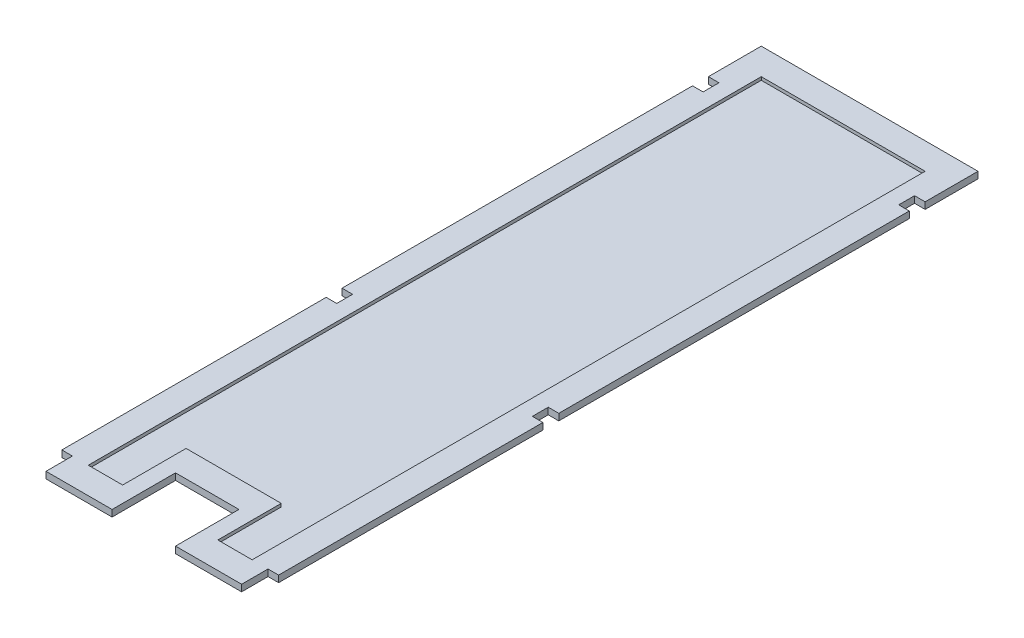
ISO-10303-21;
HEADER;
FILE_DESCRIPTION(('STEP AP214'),'2;1');
FILE_NAME('part.step','',(''),(''),'','','');
FILE_SCHEMA(('AUTOMOTIVE_DESIGN { 1 0 10303 214 1 1 1 1 }'));
ENDSEC;
DATA;
#1=APPLICATION_CONTEXT('core data for automotive mechanical design processes');
#2=APPLICATION_PROTOCOL_DEFINITION('international standard','automotive_design',2000,#1);
#3=PRODUCT_CONTEXT('',#1,'mechanical');
#4=PRODUCT('Part','Part','',(#3));
#5=PRODUCT_RELATED_PRODUCT_CATEGORY('part','',(#4));
#6=PRODUCT_DEFINITION_FORMATION('','',#4);
#7=PRODUCT_DEFINITION_CONTEXT('part definition',#1,'design');
#8=PRODUCT_DEFINITION('design','',#6,#7);
#9=PRODUCT_DEFINITION_SHAPE('','',#8);
#10=(LENGTH_UNIT() NAMED_UNIT(*) SI_UNIT(.MILLI.,.METRE.));
#11=(NAMED_UNIT(*) PLANE_ANGLE_UNIT() SI_UNIT($,.RADIAN.));
#12=(NAMED_UNIT(*) SI_UNIT($,.STERADIAN.) SOLID_ANGLE_UNIT());
#13=UNCERTAINTY_MEASURE_WITH_UNIT(LENGTH_MEASURE(1.E-05),#10,'distance_accuracy_value','');
#14=(GEOMETRIC_REPRESENTATION_CONTEXT(3) GLOBAL_UNCERTAINTY_ASSIGNED_CONTEXT((#13)) GLOBAL_UNIT_ASSIGNED_CONTEXT((#10,
#11,#12)) REPRESENTATION_CONTEXT('',''));
#15=CARTESIAN_POINT('',(0.,0.,0.));
#16=DIRECTION('',(0.,0.,1.));
#17=DIRECTION('',(1.,0.,0.));
#18=AXIS2_PLACEMENT_3D('',#15,#16,#17);
#19=CARTESIAN_POINT('',(0.,1.25,-55.));
#20=DIRECTION('',(0.,0.,1.));
#21=DIRECTION('',(1.,0.,0.));
#22=AXIS2_PLACEMENT_3D('',#19,#20,#21);
#23=PLANE('',#22);
#24=DIRECTION('',(-1.,0.,0.));
#25=VECTOR('',#24,1.);
#26=CARTESIAN_POINT('',(0.,0.,-55.));
#27=LINE('',#26,#25);
#28=CARTESIAN_POINT('',(2.00000000000002,0.,-55.));
#29=VERTEX_POINT('',#28);
#30=CARTESIAN_POINT('',(0.,0.,-55.));
#31=VERTEX_POINT('',#30);
#32=EDGE_CURVE('E260',#29,#31,#27,.T.);
#33=ORIENTED_EDGE('',*,*,#32,.T.);
#34=DIRECTION('',(0.,-1.,0.));
#35=VECTOR('',#34,1.);
#36=CARTESIAN_POINT('',(0.,1.25,-55.));
#37=LINE('',#36,#35);
#38=CARTESIAN_POINT('',(0.,1.25,-55.));
#39=VERTEX_POINT('',#38);
#40=EDGE_CURVE('E11',#39,#31,#37,.T.);
#41=ORIENTED_EDGE('',*,*,#40,.F.);
#42=DIRECTION('',(-1.,0.,0.));
#43=VECTOR('',#42,1.);
#44=CARTESIAN_POINT('',(0.,1.25,-55.));
#45=LINE('',#44,#43);
#46=CARTESIAN_POINT('',(2.00000000000002,1.25,-55.));
#47=VERTEX_POINT('',#46);
#48=EDGE_CURVE('E316',#47,#39,#45,.T.);
#49=ORIENTED_EDGE('',*,*,#48,.F.);
#50=DIRECTION('',(0.,-1.,0.));
#51=VECTOR('',#50,1.);
#52=CARTESIAN_POINT('',(2.00000000000002,1.25,-55.));
#53=LINE('',#52,#51);
#54=EDGE_CURVE('E256',#47,#29,#53,.T.);
#55=ORIENTED_EDGE('',*,*,#54,.T.);
#56=EDGE_LOOP('',(#33,#41,#49,#55));
#57=FACE_BOUND('',#56,.T.);
#58=ADVANCED_FACE('F32',(#57),#23,.F.);
#59=CARTESIAN_POINT('',(0.,1.25,-5.));
#60=DIRECTION('',(1.,0.,0.));
#61=DIRECTION('',(0.,0.,-1.));
#62=AXIS2_PLACEMENT_3D('',#59,#60,#61);
#63=PLANE('',#62);
#64=DIRECTION('',(0.,0.,1.));
#65=VECTOR('',#64,1.);
#66=CARTESIAN_POINT('',(0.,0.,-5.));
#67=LINE('',#66,#65);
#68=CARTESIAN_POINT('',(0.,0.,-5.));
#69=VERTEX_POINT('',#68);
#70=EDGE_CURVE('E263',#31,#69,#67,.T.);
#71=ORIENTED_EDGE('',*,*,#70,.T.);
#72=DIRECTION('',(0.,-1.,0.));
#73=VECTOR('',#72,1.);
#74=CARTESIAN_POINT('',(0.,1.25,-5.));
#75=LINE('',#74,#73);
#76=CARTESIAN_POINT('',(0.,1.25,-5.));
#77=VERTEX_POINT('',#76);
#78=EDGE_CURVE('E39',#77,#69,#75,.T.);
#79=ORIENTED_EDGE('',*,*,#78,.F.);
#80=DIRECTION('',(0.,0.,1.));
#81=VECTOR('',#80,1.);
#82=CARTESIAN_POINT('',(0.,1.25,-5.));
#83=LINE('',#82,#81);
#84=EDGE_CURVE('E156',#39,#77,#83,.T.);
#85=ORIENTED_EDGE('',*,*,#84,.F.);
#86=ORIENTED_EDGE('',*,*,#40,.T.);
#87=EDGE_LOOP('',(#71,#79,#85,#86));
#88=FACE_BOUND('',#87,.T.);
#89=ADVANCED_FACE('F608',(#88),#63,.F.);
#90=CARTESIAN_POINT('',(0.,1.25,-5.));
#91=DIRECTION('',(0.,0.,-1.));
#92=DIRECTION('',(-1.,0.,0.));
#93=AXIS2_PLACEMENT_3D('',#90,#91,#92);
#94=PLANE('',#93);
#95=DIRECTION('',(1.,0.,0.));
#96=VECTOR('',#95,1.);
#97=CARTESIAN_POINT('',(0.,0.,-5.));
#98=LINE('',#97,#96);
#99=CARTESIAN_POINT('',(2.,0.,-5.));
#100=VERTEX_POINT('',#99);
#101=EDGE_CURVE('E266',#69,#100,#98,.T.);
#102=ORIENTED_EDGE('',*,*,#101,.T.);
#103=DIRECTION('',(0.,-1.,0.));
#104=VECTOR('',#103,1.);
#105=CARTESIAN_POINT('',(2.,1.25,-5.));
#106=LINE('',#105,#104);
#107=CARTESIAN_POINT('',(2.,1.25,-5.));
#108=VERTEX_POINT('',#107);
#109=EDGE_CURVE('E383',#108,#100,#106,.T.);
#110=ORIENTED_EDGE('',*,*,#109,.F.);
#111=DIRECTION('',(1.,0.,0.));
#112=VECTOR('',#111,1.);
#113=CARTESIAN_POINT('',(0.,1.25,-5.));
#114=LINE('',#113,#112);
#115=EDGE_CURVE('E391',#77,#108,#114,.T.);
#116=ORIENTED_EDGE('',*,*,#115,.F.);
#117=ORIENTED_EDGE('',*,*,#78,.T.);
#118=EDGE_LOOP('',(#102,#110,#116,#117));
#119=FACE_BOUND('',#118,.T.);
#120=ADVANCED_FACE('F389',(#119),#94,.F.);
#121=CARTESIAN_POINT('',(2.,1.25,0.));
#122=DIRECTION('',(1.,0.,0.));
#123=DIRECTION('',(0.,0.,-1.));
#124=AXIS2_PLACEMENT_3D('',#121,#122,#123);
#125=PLANE('',#124);
#126=DIRECTION('',(0.,0.,1.));
#127=VECTOR('',#126,1.);
#128=CARTESIAN_POINT('',(2.,0.,0.));
#129=LINE('',#128,#127);
#130=CARTESIAN_POINT('',(2.,0.,0.));
#131=VERTEX_POINT('',#130);
#132=EDGE_CURVE('E268',#100,#131,#129,.T.);
#133=ORIENTED_EDGE('',*,*,#132,.T.);
#134=DIRECTION('',(0.,-1.,0.));
#135=VECTOR('',#134,1.);
#136=CARTESIAN_POINT('',(2.,1.25,0.));
#137=LINE('',#136,#135);
#138=CARTESIAN_POINT('',(2.,1.25,0.));
#139=VERTEX_POINT('',#138);
#140=EDGE_CURVE('E380',#139,#131,#137,.T.);
#141=ORIENTED_EDGE('',*,*,#140,.F.);
#142=DIRECTION('',(0.,0.,1.));
#143=VECTOR('',#142,1.);
#144=CARTESIAN_POINT('',(2.,1.25,0.));
#145=LINE('',#144,#143);
#146=EDGE_CURVE('E409',#108,#139,#145,.T.);
#147=ORIENTED_EDGE('',*,*,#146,.F.);
#148=ORIENTED_EDGE('',*,*,#109,.T.);
#149=EDGE_LOOP('',(#133,#141,#147,#148));
#150=FACE_BOUND('',#149,.T.);
#151=ADVANCED_FACE('F400',(#150),#125,.F.);
#152=CARTESIAN_POINT('',(2.,1.25,0.));
#153=DIRECTION('',(0.,0.,-1.));
#154=DIRECTION('',(-1.,0.,0.));
#155=AXIS2_PLACEMENT_3D('',#152,#153,#154);
#156=PLANE('',#155);
#157=DIRECTION('',(1.,0.,0.));
#158=VECTOR('',#157,1.);
#159=CARTESIAN_POINT('',(2.,0.,0.));
#160=LINE('',#159,#158);
#161=CARTESIAN_POINT('',(14.5,0.,0.));
#162=VERTEX_POINT('',#161);
#163=EDGE_CURVE('E270',#131,#162,#160,.T.);
#164=ORIENTED_EDGE('',*,*,#163,.T.);
#165=DIRECTION('',(0.,-1.,0.));
#166=VECTOR('',#165,1.);
#167=CARTESIAN_POINT('',(14.5,1.25,0.));
#168=LINE('',#167,#166);
#169=CARTESIAN_POINT('',(14.5,1.25,0.));
#170=VERTEX_POINT('',#169);
#171=EDGE_CURVE('E377',#170,#162,#168,.T.);
#172=ORIENTED_EDGE('',*,*,#171,.F.);
#173=DIRECTION('',(1.,0.,0.));
#174=VECTOR('',#173,1.);
#175=CARTESIAN_POINT('',(2.,1.25,0.));
#176=LINE('',#175,#174);
#177=EDGE_CURVE('E406',#139,#170,#176,.T.);
#178=ORIENTED_EDGE('',*,*,#177,.F.);
#179=ORIENTED_EDGE('',*,*,#140,.T.);
#180=EDGE_LOOP('',(#164,#172,#178,#179));
#181=FACE_BOUND('',#180,.T.);
#182=ADVANCED_FACE('F404',(#181),#156,.F.);
#183=CARTESIAN_POINT('',(14.5,1.25,0.));
#184=DIRECTION('',(-1.,0.,0.));
#185=DIRECTION('',(0.,0.,1.));
#186=AXIS2_PLACEMENT_3D('',#183,#184,#185);
#187=PLANE('',#186);
#188=DIRECTION('',(0.,0.,-1.));
#189=VECTOR('',#188,1.);
#190=CARTESIAN_POINT('',(14.5,0.,0.));
#191=LINE('',#190,#189);
#192=CARTESIAN_POINT('',(14.5,0.,-12.));
#193=VERTEX_POINT('',#192);
#194=EDGE_CURVE('E272',#162,#193,#191,.T.);
#195=ORIENTED_EDGE('',*,*,#194,.T.);
#196=DIRECTION('',(0.,-1.,0.));
#197=VECTOR('',#196,1.);
#198=CARTESIAN_POINT('',(14.5,1.25,-12.));
#199=LINE('',#198,#197);
#200=CARTESIAN_POINT('',(14.5,1.25,-12.));
#201=VERTEX_POINT('',#200);
#202=EDGE_CURVE('E374',#201,#193,#199,.T.);
#203=ORIENTED_EDGE('',*,*,#202,.F.);
#204=DIRECTION('',(0.,0.,-1.));
#205=VECTOR('',#204,1.);
#206=CARTESIAN_POINT('',(14.5,1.25,0.));
#207=LINE('',#206,#205);
#208=EDGE_CURVE('E408',#170,#201,#207,.T.);
#209=ORIENTED_EDGE('',*,*,#208,.F.);
#210=ORIENTED_EDGE('',*,*,#171,.T.);
#211=EDGE_LOOP('',(#195,#203,#209,#210));
#212=FACE_BOUND('',#211,.T.);
#213=ADVANCED_FACE('F621',(#212),#187,.F.);
#214=CARTESIAN_POINT('',(14.5,1.25,-12.));
#215=DIRECTION('',(0.,0.,-1.));
#216=DIRECTION('',(-1.,0.,0.));
#217=AXIS2_PLACEMENT_3D('',#214,#215,#216);
#218=PLANE('',#217);
#219=DIRECTION('',(1.,0.,0.));
#220=VECTOR('',#219,1.);
#221=CARTESIAN_POINT('',(14.5,0.,-12.));
#222=LINE('',#221,#220);
#223=CARTESIAN_POINT('',(26.5,0.,-12.));
#224=VERTEX_POINT('',#223);
#225=EDGE_CURVE('E274',#193,#224,#222,.T.);
#226=ORIENTED_EDGE('',*,*,#225,.T.);
#227=DIRECTION('',(0.,-1.,0.));
#228=VECTOR('',#227,1.);
#229=CARTESIAN_POINT('',(26.5,1.25,-12.));
#230=LINE('',#229,#228);
#231=CARTESIAN_POINT('',(26.5,1.25,-12.));
#232=VERTEX_POINT('',#231);
#233=EDGE_CURVE('E371',#232,#224,#230,.T.);
#234=ORIENTED_EDGE('',*,*,#233,.F.);
#235=DIRECTION('',(1.,0.,0.));
#236=VECTOR('',#235,1.);
#237=CARTESIAN_POINT('',(14.5,1.25,-12.));
#238=LINE('',#237,#236);
#239=EDGE_CURVE('E411',#201,#232,#238,.T.);
#240=ORIENTED_EDGE('',*,*,#239,.F.);
#241=ORIENTED_EDGE('',*,*,#202,.T.);
#242=EDGE_LOOP('',(#226,#234,#240,#241));
#243=FACE_BOUND('',#242,.T.);
#244=ADVANCED_FACE('F624',(#243),#218,.F.);
#245=CARTESIAN_POINT('',(26.5,1.25,0.));
#246=DIRECTION('',(1.,0.,0.));
#247=DIRECTION('',(0.,0.,-1.));
#248=AXIS2_PLACEMENT_3D('',#245,#246,#247);
#249=PLANE('',#248);
#250=DIRECTION('',(0.,0.,1.));
#251=VECTOR('',#250,1.);
#252=CARTESIAN_POINT('',(26.5,0.,0.));
#253=LINE('',#252,#251);
#254=CARTESIAN_POINT('',(26.5,0.,0.));
#255=VERTEX_POINT('',#254);
#256=EDGE_CURVE('E276',#224,#255,#253,.T.);
#257=ORIENTED_EDGE('',*,*,#256,.T.);
#258=DIRECTION('',(0.,-1.,0.));
#259=VECTOR('',#258,1.);
#260=CARTESIAN_POINT('',(26.5,1.25,0.));
#261=LINE('',#260,#259);
#262=CARTESIAN_POINT('',(26.5,1.25,0.));
#263=VERTEX_POINT('',#262);
#264=EDGE_CURVE('E368',#263,#255,#261,.T.);
#265=ORIENTED_EDGE('',*,*,#264,.F.);
#266=DIRECTION('',(0.,0.,1.));
#267=VECTOR('',#266,1.);
#268=CARTESIAN_POINT('',(26.5,1.25,0.));
#269=LINE('',#268,#267);
#270=EDGE_CURVE('E417',#232,#263,#269,.T.);
#271=ORIENTED_EDGE('',*,*,#270,.F.);
#272=ORIENTED_EDGE('',*,*,#233,.T.);
#273=EDGE_LOOP('',(#257,#265,#271,#272));
#274=FACE_BOUND('',#273,.T.);
#275=ADVANCED_FACE('F628',(#274),#249,.F.);
#276=CARTESIAN_POINT('',(26.5,1.25,0.));
#277=DIRECTION('',(0.,0.,-1.));
#278=DIRECTION('',(-1.,0.,0.));
#279=AXIS2_PLACEMENT_3D('',#276,#277,#278);
#280=PLANE('',#279);
#281=DIRECTION('',(1.,0.,0.));
#282=VECTOR('',#281,1.);
#283=CARTESIAN_POINT('',(26.5,0.,0.));
#284=LINE('',#283,#282);
#285=CARTESIAN_POINT('',(39.,0.,0.));
#286=VERTEX_POINT('',#285);
#287=EDGE_CURVE('E278',#255,#286,#284,.T.);
#288=ORIENTED_EDGE('',*,*,#287,.T.);
#289=DIRECTION('',(0.,-1.,0.));
#290=VECTOR('',#289,1.);
#291=CARTESIAN_POINT('',(39.,1.25,0.));
#292=LINE('',#291,#290);
#293=CARTESIAN_POINT('',(39.,1.25,0.));
#294=VERTEX_POINT('',#293);
#295=EDGE_CURVE('E365',#294,#286,#292,.T.);
#296=ORIENTED_EDGE('',*,*,#295,.F.);
#297=DIRECTION('',(1.,0.,0.));
#298=VECTOR('',#297,1.);
#299=CARTESIAN_POINT('',(26.5,1.25,0.));
#300=LINE('',#299,#298);
#301=EDGE_CURVE('E419',#263,#294,#300,.T.);
#302=ORIENTED_EDGE('',*,*,#301,.F.);
#303=ORIENTED_EDGE('',*,*,#264,.T.);
#304=EDGE_LOOP('',(#288,#296,#302,#303));
#305=FACE_BOUND('',#304,.T.);
#306=ADVANCED_FACE('F632',(#305),#280,.F.);
#307=CARTESIAN_POINT('',(39.,1.25,0.));
#308=DIRECTION('',(-1.,0.,0.));
#309=DIRECTION('',(0.,0.,1.));
#310=AXIS2_PLACEMENT_3D('',#307,#308,#309);
#311=PLANE('',#310);
#312=DIRECTION('',(0.,0.,-1.));
#313=VECTOR('',#312,1.);
#314=CARTESIAN_POINT('',(39.,0.,0.));
#315=LINE('',#314,#313);
#316=CARTESIAN_POINT('',(39.,0.,-5.));
#317=VERTEX_POINT('',#316);
#318=EDGE_CURVE('E280',#286,#317,#315,.T.);
#319=ORIENTED_EDGE('',*,*,#318,.T.);
#320=DIRECTION('',(0.,-1.,0.));
#321=VECTOR('',#320,1.);
#322=CARTESIAN_POINT('',(39.,1.25,-5.));
#323=LINE('',#322,#321);
#324=CARTESIAN_POINT('',(39.,1.25,-5.));
#325=VERTEX_POINT('',#324);
#326=EDGE_CURVE('E362',#325,#317,#323,.T.);
#327=ORIENTED_EDGE('',*,*,#326,.F.);
#328=DIRECTION('',(0.,0.,-1.));
#329=VECTOR('',#328,1.);
#330=CARTESIAN_POINT('',(39.,1.25,0.));
#331=LINE('',#330,#329);
#332=EDGE_CURVE('E421',#294,#325,#331,.T.);
#333=ORIENTED_EDGE('',*,*,#332,.F.);
#334=ORIENTED_EDGE('',*,*,#295,.T.);
#335=EDGE_LOOP('',(#319,#327,#333,#334));
#336=FACE_BOUND('',#335,.T.);
#337=ADVANCED_FACE('F636',(#336),#311,.F.);
#338=CARTESIAN_POINT('',(41.,1.25,-5.));
#339=DIRECTION('',(0.,0.,-1.));
#340=DIRECTION('',(-1.,0.,0.));
#341=AXIS2_PLACEMENT_3D('',#338,#339,#340);
#342=PLANE('',#341);
#343=DIRECTION('',(1.,0.,0.));
#344=VECTOR('',#343,1.);
#345=CARTESIAN_POINT('',(41.,0.,-5.));
#346=LINE('',#345,#344);
#347=CARTESIAN_POINT('',(41.,0.,-5.));
#348=VERTEX_POINT('',#347);
#349=EDGE_CURVE('E282',#317,#348,#346,.T.);
#350=ORIENTED_EDGE('',*,*,#349,.T.);
#351=DIRECTION('',(0.,-1.,0.));
#352=VECTOR('',#351,1.);
#353=CARTESIAN_POINT('',(41.,1.25,-5.));
#354=LINE('',#353,#352);
#355=CARTESIAN_POINT('',(41.,1.25,-5.));
#356=VERTEX_POINT('',#355);
#357=EDGE_CURVE('E359',#356,#348,#354,.T.);
#358=ORIENTED_EDGE('',*,*,#357,.F.);
#359=DIRECTION('',(1.,0.,0.));
#360=VECTOR('',#359,1.);
#361=CARTESIAN_POINT('',(41.,1.25,-5.));
#362=LINE('',#361,#360);
#363=EDGE_CURVE('E423',#325,#356,#362,.T.);
#364=ORIENTED_EDGE('',*,*,#363,.F.);
#365=ORIENTED_EDGE('',*,*,#326,.T.);
#366=EDGE_LOOP('',(#350,#358,#364,#365));
#367=FACE_BOUND('',#366,.T.);
#368=ADVANCED_FACE('F640',(#367),#342,.F.);
#369=CARTESIAN_POINT('',(41.,1.25,-5.));
#370=DIRECTION('',(-1.,0.,0.));
#371=DIRECTION('',(0.,0.,1.));
#372=AXIS2_PLACEMENT_3D('',#369,#370,#371);
#373=PLANE('',#372);
#374=DIRECTION('',(0.,0.,-1.));
#375=VECTOR('',#374,1.);
#376=CARTESIAN_POINT('',(41.,0.,-5.));
#377=LINE('',#376,#375);
#378=CARTESIAN_POINT('',(41.,0.,-55.));
#379=VERTEX_POINT('',#378);
#380=EDGE_CURVE('E284',#348,#379,#377,.T.);
#381=ORIENTED_EDGE('',*,*,#380,.T.);
#382=DIRECTION('',(0.,-1.,0.));
#383=VECTOR('',#382,1.);
#384=CARTESIAN_POINT('',(41.,1.25,-55.));
#385=LINE('',#384,#383);
#386=CARTESIAN_POINT('',(41.,1.25,-55.));
#387=VERTEX_POINT('',#386);
#388=EDGE_CURVE('E356',#387,#379,#385,.T.);
#389=ORIENTED_EDGE('',*,*,#388,.F.);
#390=DIRECTION('',(0.,0.,-1.));
#391=VECTOR('',#390,1.);
#392=CARTESIAN_POINT('',(41.,1.25,-5.));
#393=LINE('',#392,#391);
#394=EDGE_CURVE('E425',#356,#387,#393,.T.);
#395=ORIENTED_EDGE('',*,*,#394,.F.);
#396=ORIENTED_EDGE('',*,*,#357,.T.);
#397=EDGE_LOOP('',(#381,#389,#395,#396));
#398=FACE_BOUND('',#397,.T.);
#399=ADVANCED_FACE('F644',(#398),#373,.F.);
#400=CARTESIAN_POINT('',(41.,1.25,-55.));
#401=DIRECTION('',(0.,0.,1.));
#402=DIRECTION('',(1.,0.,0.));
#403=AXIS2_PLACEMENT_3D('',#400,#401,#402);
#404=PLANE('',#403);
#405=DIRECTION('',(-1.,0.,0.));
#406=VECTOR('',#405,1.);
#407=CARTESIAN_POINT('',(41.,0.,-55.));
#408=LINE('',#407,#406);
#409=CARTESIAN_POINT('',(39.,0.,-55.));
#410=VERTEX_POINT('',#409);
#411=EDGE_CURVE('E286',#379,#410,#408,.T.);
#412=ORIENTED_EDGE('',*,*,#411,.T.);
#413=DIRECTION('',(0.,-1.,0.));
#414=VECTOR('',#413,1.);
#415=CARTESIAN_POINT('',(39.,1.25,-55.));
#416=LINE('',#415,#414);
#417=CARTESIAN_POINT('',(39.,1.25,-55.));
#418=VERTEX_POINT('',#417);
#419=EDGE_CURVE('E353',#418,#410,#416,.T.);
#420=ORIENTED_EDGE('',*,*,#419,.F.);
#421=DIRECTION('',(-1.,0.,0.));
#422=VECTOR('',#421,1.);
#423=CARTESIAN_POINT('',(41.,1.25,-55.));
#424=LINE('',#423,#422);
#425=EDGE_CURVE('E427',#387,#418,#424,.T.);
#426=ORIENTED_EDGE('',*,*,#425,.F.);
#427=ORIENTED_EDGE('',*,*,#388,.T.);
#428=EDGE_LOOP('',(#412,#420,#426,#427));
#429=FACE_BOUND('',#428,.T.);
#430=ADVANCED_FACE('F648',(#429),#404,.F.);
#431=CARTESIAN_POINT('',(39.,1.25,-55.));
#432=DIRECTION('',(-1.,0.,0.));
#433=DIRECTION('',(0.,0.,1.));
#434=AXIS2_PLACEMENT_3D('',#431,#432,#433);
#435=PLANE('',#434);
#436=DIRECTION('',(0.,0.,-1.));
#437=VECTOR('',#436,1.);
#438=CARTESIAN_POINT('',(39.,0.,-55.));
#439=LINE('',#438,#437);
#440=CARTESIAN_POINT('',(39.,0.,-58.));
#441=VERTEX_POINT('',#440);
#442=EDGE_CURVE('E288',#410,#441,#439,.T.);
#443=ORIENTED_EDGE('',*,*,#442,.T.);
#444=DIRECTION('',(0.,-1.,0.));
#445=VECTOR('',#444,1.);
#446=CARTESIAN_POINT('',(39.,1.25,-58.));
#447=LINE('',#446,#445);
#448=CARTESIAN_POINT('',(39.,1.25,-58.));
#449=VERTEX_POINT('',#448);
#450=EDGE_CURVE('E350',#449,#441,#447,.T.);
#451=ORIENTED_EDGE('',*,*,#450,.F.);
#452=DIRECTION('',(0.,0.,-1.));
#453=VECTOR('',#452,1.);
#454=CARTESIAN_POINT('',(39.,1.25,-55.));
#455=LINE('',#454,#453);
#456=EDGE_CURVE('E429',#418,#449,#455,.T.);
#457=ORIENTED_EDGE('',*,*,#456,.F.);
#458=ORIENTED_EDGE('',*,*,#419,.T.);
#459=EDGE_LOOP('',(#443,#451,#457,#458));
#460=FACE_BOUND('',#459,.T.);
#461=ADVANCED_FACE('F652',(#460),#435,.F.);
#462=CARTESIAN_POINT('',(41.,1.25,-58.));
#463=DIRECTION('',(0.,0.,-1.));
#464=DIRECTION('',(-1.,0.,0.));
#465=AXIS2_PLACEMENT_3D('',#462,#463,#464);
#466=PLANE('',#465);
#467=DIRECTION('',(1.,0.,0.));
#468=VECTOR('',#467,1.);
#469=CARTESIAN_POINT('',(41.,0.,-58.));
#470=LINE('',#469,#468);
#471=CARTESIAN_POINT('',(41.,0.,-58.));
#472=VERTEX_POINT('',#471);
#473=EDGE_CURVE('E290',#441,#472,#470,.T.);
#474=ORIENTED_EDGE('',*,*,#473,.T.);
#475=DIRECTION('',(0.,-1.,0.));
#476=VECTOR('',#475,1.);
#477=CARTESIAN_POINT('',(41.,1.25,-58.));
#478=LINE('',#477,#476);
#479=CARTESIAN_POINT('',(41.,1.25,-58.));
#480=VERTEX_POINT('',#479);
#481=EDGE_CURVE('E347',#480,#472,#478,.T.);
#482=ORIENTED_EDGE('',*,*,#481,.F.);
#483=DIRECTION('',(1.,0.,0.));
#484=VECTOR('',#483,1.);
#485=CARTESIAN_POINT('',(41.,1.25,-58.));
#486=LINE('',#485,#484);
#487=EDGE_CURVE('E431',#449,#480,#486,.T.);
#488=ORIENTED_EDGE('',*,*,#487,.F.);
#489=ORIENTED_EDGE('',*,*,#450,.T.);
#490=EDGE_LOOP('',(#474,#482,#488,#489));
#491=FACE_BOUND('',#490,.T.);
#492=ADVANCED_FACE('F656',(#491),#466,.F.);
#493=CARTESIAN_POINT('',(41.,1.25,-58.));
#494=DIRECTION('',(-1.,0.,0.));
#495=DIRECTION('',(0.,0.,1.));
#496=AXIS2_PLACEMENT_3D('',#493,#494,#495);
#497=PLANE('',#496);
#498=DIRECTION('',(0.,0.,-1.));
#499=VECTOR('',#498,1.);
#500=CARTESIAN_POINT('',(41.,0.,-58.));
#501=LINE('',#500,#499);
#502=CARTESIAN_POINT('',(41.,0.,-124.3));
#503=VERTEX_POINT('',#502);
#504=EDGE_CURVE('E292',#472,#503,#501,.T.);
#505=ORIENTED_EDGE('',*,*,#504,.T.);
#506=DIRECTION('',(0.,-1.,0.));
#507=VECTOR('',#506,1.);
#508=CARTESIAN_POINT('',(41.,1.25,-124.3));
#509=LINE('',#508,#507);
#510=CARTESIAN_POINT('',(41.,1.25,-124.3));
#511=VERTEX_POINT('',#510);
#512=EDGE_CURVE('E344',#511,#503,#509,.T.);
#513=ORIENTED_EDGE('',*,*,#512,.F.);
#514=DIRECTION('',(0.,0.,-1.));
#515=VECTOR('',#514,1.);
#516=CARTESIAN_POINT('',(41.,1.25,-58.));
#517=LINE('',#516,#515);
#518=EDGE_CURVE('E433',#480,#511,#517,.T.);
#519=ORIENTED_EDGE('',*,*,#518,.F.);
#520=ORIENTED_EDGE('',*,*,#481,.T.);
#521=EDGE_LOOP('',(#505,#513,#519,#520));
#522=FACE_BOUND('',#521,.T.);
#523=ADVANCED_FACE('F660',(#522),#497,.F.);
#524=CARTESIAN_POINT('',(41.,1.25,-124.3));
#525=DIRECTION('',(0.,0.,1.));
#526=DIRECTION('',(1.,0.,0.));
#527=AXIS2_PLACEMENT_3D('',#524,#525,#526);
#528=PLANE('',#527);
#529=DIRECTION('',(-1.,0.,0.));
#530=VECTOR('',#529,1.);
#531=CARTESIAN_POINT('',(41.,0.,-124.3));
#532=LINE('',#531,#530);
#533=CARTESIAN_POINT('',(39.,0.,-124.3));
#534=VERTEX_POINT('',#533);
#535=EDGE_CURVE('E294',#503,#534,#532,.T.);
#536=ORIENTED_EDGE('',*,*,#535,.T.);
#537=DIRECTION('',(0.,-1.,0.));
#538=VECTOR('',#537,1.);
#539=CARTESIAN_POINT('',(39.,1.25,-124.3));
#540=LINE('',#539,#538);
#541=CARTESIAN_POINT('',(39.,1.25,-124.3));
#542=VERTEX_POINT('',#541);
#543=EDGE_CURVE('E341',#542,#534,#540,.T.);
#544=ORIENTED_EDGE('',*,*,#543,.F.);
#545=DIRECTION('',(-1.,0.,0.));
#546=VECTOR('',#545,1.);
#547=CARTESIAN_POINT('',(41.,1.25,-124.3));
#548=LINE('',#547,#546);
#549=EDGE_CURVE('E435',#511,#542,#548,.T.);
#550=ORIENTED_EDGE('',*,*,#549,.F.);
#551=ORIENTED_EDGE('',*,*,#512,.T.);
#552=EDGE_LOOP('',(#536,#544,#550,#551));
#553=FACE_BOUND('',#552,.T.);
#554=ADVANCED_FACE('F664',(#553),#528,.F.);
#555=CARTESIAN_POINT('',(39.,1.25,-124.3));
#556=DIRECTION('',(-1.,0.,0.));
#557=DIRECTION('',(0.,0.,1.));
#558=AXIS2_PLACEMENT_3D('',#555,#556,#557);
#559=PLANE('',#558);
#560=DIRECTION('',(0.,0.,-1.));
#561=VECTOR('',#560,1.);
#562=CARTESIAN_POINT('',(39.,0.,-124.3));
#563=LINE('',#562,#561);
#564=CARTESIAN_POINT('',(39.,0.,-127.3));
#565=VERTEX_POINT('',#564);
#566=EDGE_CURVE('E296',#534,#565,#563,.T.);
#567=ORIENTED_EDGE('',*,*,#566,.T.);
#568=DIRECTION('',(0.,-1.,0.));
#569=VECTOR('',#568,1.);
#570=CARTESIAN_POINT('',(39.,1.25,-127.3));
#571=LINE('',#570,#569);
#572=CARTESIAN_POINT('',(39.,1.25,-127.3));
#573=VERTEX_POINT('',#572);
#574=EDGE_CURVE('E338',#573,#565,#571,.T.);
#575=ORIENTED_EDGE('',*,*,#574,.F.);
#576=DIRECTION('',(0.,0.,-1.));
#577=VECTOR('',#576,1.);
#578=CARTESIAN_POINT('',(39.,1.25,-124.3));
#579=LINE('',#578,#577);
#580=EDGE_CURVE('E437',#542,#573,#579,.T.);
#581=ORIENTED_EDGE('',*,*,#580,.F.);
#582=ORIENTED_EDGE('',*,*,#543,.T.);
#583=EDGE_LOOP('',(#567,#575,#581,#582));
#584=FACE_BOUND('',#583,.T.);
#585=ADVANCED_FACE('F668',(#584),#559,.F.);
#586=CARTESIAN_POINT('',(41.,1.25,-127.3));
#587=DIRECTION('',(0.,0.,-1.));
#588=DIRECTION('',(-1.,0.,0.));
#589=AXIS2_PLACEMENT_3D('',#586,#587,#588);
#590=PLANE('',#589);
#591=DIRECTION('',(1.,0.,0.));
#592=VECTOR('',#591,1.);
#593=CARTESIAN_POINT('',(41.,0.,-127.3));
#594=LINE('',#593,#592);
#595=CARTESIAN_POINT('',(41.,0.,-127.3));
#596=VERTEX_POINT('',#595);
#597=EDGE_CURVE('E298',#565,#596,#594,.T.);
#598=ORIENTED_EDGE('',*,*,#597,.T.);
#599=DIRECTION('',(0.,-1.,0.));
#600=VECTOR('',#599,1.);
#601=CARTESIAN_POINT('',(41.,1.25,-127.3));
#602=LINE('',#601,#600);
#603=CARTESIAN_POINT('',(41.,1.25,-127.3));
#604=VERTEX_POINT('',#603);
#605=EDGE_CURVE('E335',#604,#596,#602,.T.);
#606=ORIENTED_EDGE('',*,*,#605,.F.);
#607=DIRECTION('',(1.,0.,0.));
#608=VECTOR('',#607,1.);
#609=CARTESIAN_POINT('',(41.,1.25,-127.3));
#610=LINE('',#609,#608);
#611=EDGE_CURVE('E439',#573,#604,#610,.T.);
#612=ORIENTED_EDGE('',*,*,#611,.F.);
#613=ORIENTED_EDGE('',*,*,#574,.T.);
#614=EDGE_LOOP('',(#598,#606,#612,#613));
#615=FACE_BOUND('',#614,.T.);
#616=ADVANCED_FACE('F672',(#615),#590,.F.);
#617=CARTESIAN_POINT('',(41.,1.25,-127.3));
#618=DIRECTION('',(-1.,0.,0.));
#619=DIRECTION('',(0.,0.,1.));
#620=AXIS2_PLACEMENT_3D('',#617,#618,#619);
#621=PLANE('',#620);
#622=DIRECTION('',(0.,0.,-1.));
#623=VECTOR('',#622,1.);
#624=CARTESIAN_POINT('',(41.,0.,-127.3));
#625=LINE('',#624,#623);
#626=CARTESIAN_POINT('',(41.,0.,-137.3));
#627=VERTEX_POINT('',#626);
#628=EDGE_CURVE('E300',#596,#627,#625,.T.);
#629=ORIENTED_EDGE('',*,*,#628,.T.);
#630=DIRECTION('',(0.,-1.,0.));
#631=VECTOR('',#630,1.);
#632=CARTESIAN_POINT('',(41.,1.25,-137.3));
#633=LINE('',#632,#631);
#634=CARTESIAN_POINT('',(41.,1.25,-137.3));
#635=VERTEX_POINT('',#634);
#636=EDGE_CURVE('E332',#635,#627,#633,.T.);
#637=ORIENTED_EDGE('',*,*,#636,.F.);
#638=DIRECTION('',(0.,0.,-1.));
#639=VECTOR('',#638,1.);
#640=CARTESIAN_POINT('',(41.,1.25,-127.3));
#641=LINE('',#640,#639);
#642=EDGE_CURVE('E441',#604,#635,#641,.T.);
#643=ORIENTED_EDGE('',*,*,#642,.F.);
#644=ORIENTED_EDGE('',*,*,#605,.T.);
#645=EDGE_LOOP('',(#629,#637,#643,#644));
#646=FACE_BOUND('',#645,.T.);
#647=ADVANCED_FACE('F676',(#646),#621,.F.);
#648=CARTESIAN_POINT('',(0.,1.25,-137.3));
#649=DIRECTION('',(0.,0.,1.));
#650=DIRECTION('',(1.,0.,0.));
#651=AXIS2_PLACEMENT_3D('',#648,#649,#650);
#652=PLANE('',#651);
#653=DIRECTION('',(-1.,0.,0.));
#654=VECTOR('',#653,1.);
#655=CARTESIAN_POINT('',(0.,0.,-137.3));
#656=LINE('',#655,#654);
#657=CARTESIAN_POINT('',(0.,0.,-137.3));
#658=VERTEX_POINT('',#657);
#659=EDGE_CURVE('E302',#627,#658,#656,.T.);
#660=ORIENTED_EDGE('',*,*,#659,.T.);
#661=DIRECTION('',(0.,-1.,0.));
#662=VECTOR('',#661,1.);
#663=CARTESIAN_POINT('',(0.,1.25,-137.3));
#664=LINE('',#663,#662);
#665=CARTESIAN_POINT('',(0.,1.25,-137.3));
#666=VERTEX_POINT('',#665);
#667=EDGE_CURVE('E329',#666,#658,#664,.T.);
#668=ORIENTED_EDGE('',*,*,#667,.F.);
#669=DIRECTION('',(-1.,0.,0.));
#670=VECTOR('',#669,1.);
#671=CARTESIAN_POINT('',(0.,1.25,-137.3));
#672=LINE('',#671,#670);
#673=EDGE_CURVE('E443',#635,#666,#672,.T.);
#674=ORIENTED_EDGE('',*,*,#673,.F.);
#675=ORIENTED_EDGE('',*,*,#636,.T.);
#676=EDGE_LOOP('',(#660,#668,#674,#675));
#677=FACE_BOUND('',#676,.T.);
#678=ADVANCED_FACE('F680',(#677),#652,.F.);
#679=CARTESIAN_POINT('',(0.,1.25,-127.3));
#680=DIRECTION('',(1.,0.,0.));
#681=DIRECTION('',(0.,0.,-1.));
#682=AXIS2_PLACEMENT_3D('',#679,#680,#681);
#683=PLANE('',#682);
#684=DIRECTION('',(0.,0.,1.));
#685=VECTOR('',#684,1.);
#686=CARTESIAN_POINT('',(0.,0.,-127.3));
#687=LINE('',#686,#685);
#688=CARTESIAN_POINT('',(0.,0.,-127.3));
#689=VERTEX_POINT('',#688);
#690=EDGE_CURVE('E304',#658,#689,#687,.T.);
#691=ORIENTED_EDGE('',*,*,#690,.T.);
#692=DIRECTION('',(0.,-1.,0.));
#693=VECTOR('',#692,1.);
#694=CARTESIAN_POINT('',(0.,1.25,-127.3));
#695=LINE('',#694,#693);
#696=CARTESIAN_POINT('',(0.,1.25,-127.3));
#697=VERTEX_POINT('',#696);
#698=EDGE_CURVE('E326',#697,#689,#695,.T.);
#699=ORIENTED_EDGE('',*,*,#698,.F.);
#700=DIRECTION('',(0.,0.,1.));
#701=VECTOR('',#700,1.);
#702=CARTESIAN_POINT('',(0.,1.25,-127.3));
#703=LINE('',#702,#701);
#704=EDGE_CURVE('E445',#666,#697,#703,.T.);
#705=ORIENTED_EDGE('',*,*,#704,.F.);
#706=ORIENTED_EDGE('',*,*,#667,.T.);
#707=EDGE_LOOP('',(#691,#699,#705,#706));
#708=FACE_BOUND('',#707,.T.);
#709=ADVANCED_FACE('F684',(#708),#683,.F.);
#710=CARTESIAN_POINT('',(0.,1.25,-127.3));
#711=DIRECTION('',(0.,0.,-1.));
#712=DIRECTION('',(-1.,0.,0.));
#713=AXIS2_PLACEMENT_3D('',#710,#711,#712);
#714=PLANE('',#713);
#715=DIRECTION('',(1.,0.,0.));
#716=VECTOR('',#715,1.);
#717=CARTESIAN_POINT('',(0.,0.,-127.3));
#718=LINE('',#717,#716);
#719=CARTESIAN_POINT('',(2.00000000000001,0.,-127.3));
#720=VERTEX_POINT('',#719);
#721=EDGE_CURVE('E306',#689,#720,#718,.T.);
#722=ORIENTED_EDGE('',*,*,#721,.T.);
#723=DIRECTION('',(0.,-1.,0.));
#724=VECTOR('',#723,1.);
#725=CARTESIAN_POINT('',(2.00000000000001,1.25,-127.3));
#726=LINE('',#725,#724);
#727=CARTESIAN_POINT('',(2.00000000000001,1.25,-127.3));
#728=VERTEX_POINT('',#727);
#729=EDGE_CURVE('E323',#728,#720,#726,.T.);
#730=ORIENTED_EDGE('',*,*,#729,.F.);
#731=DIRECTION('',(1.,0.,0.));
#732=VECTOR('',#731,1.);
#733=CARTESIAN_POINT('',(0.,1.25,-127.3));
#734=LINE('',#733,#732);
#735=EDGE_CURVE('E447',#697,#728,#734,.T.);
#736=ORIENTED_EDGE('',*,*,#735,.F.);
#737=ORIENTED_EDGE('',*,*,#698,.T.);
#738=EDGE_LOOP('',(#722,#730,#736,#737));
#739=FACE_BOUND('',#738,.T.);
#740=ADVANCED_FACE('F688',(#739),#714,.F.);
#741=CARTESIAN_POINT('',(2.00000000000001,1.25,-127.3));
#742=DIRECTION('',(1.,0.,0.));
#743=DIRECTION('',(0.,0.,-1.));
#744=AXIS2_PLACEMENT_3D('',#741,#742,#743);
#745=PLANE('',#744);
#746=DIRECTION('',(0.,0.,1.));
#747=VECTOR('',#746,1.);
#748=CARTESIAN_POINT('',(2.00000000000001,0.,-127.3));
#749=LINE('',#748,#747);
#750=CARTESIAN_POINT('',(2.00000000000001,0.,-124.3));
#751=VERTEX_POINT('',#750);
#752=EDGE_CURVE('E308',#720,#751,#749,.T.);
#753=ORIENTED_EDGE('',*,*,#752,.T.);
#754=DIRECTION('',(0.,-1.,0.));
#755=VECTOR('',#754,1.);
#756=CARTESIAN_POINT('',(2.00000000000001,1.25,-124.3));
#757=LINE('',#756,#755);
#758=CARTESIAN_POINT('',(2.00000000000001,1.25,-124.3));
#759=VERTEX_POINT('',#758);
#760=EDGE_CURVE('E320',#759,#751,#757,.T.);
#761=ORIENTED_EDGE('',*,*,#760,.F.);
#762=DIRECTION('',(0.,0.,1.));
#763=VECTOR('',#762,1.);
#764=CARTESIAN_POINT('',(2.00000000000001,1.25,-127.3));
#765=LINE('',#764,#763);
#766=EDGE_CURVE('E449',#728,#759,#765,.T.);
#767=ORIENTED_EDGE('',*,*,#766,.F.);
#768=ORIENTED_EDGE('',*,*,#729,.T.);
#769=EDGE_LOOP('',(#753,#761,#767,#768));
#770=FACE_BOUND('',#769,.T.);
#771=ADVANCED_FACE('F455',(#770),#745,.F.);
#772=CARTESIAN_POINT('',(0.,1.25,-124.3));
#773=DIRECTION('',(0.,0.,1.));
#774=DIRECTION('',(1.,0.,0.));
#775=AXIS2_PLACEMENT_3D('',#772,#773,#774);
#776=PLANE('',#775);
#777=DIRECTION('',(-1.,0.,0.));
#778=VECTOR('',#777,1.);
#779=CARTESIAN_POINT('',(0.,0.,-124.3));
#780=LINE('',#779,#778);
#781=CARTESIAN_POINT('',(0.,0.,-124.3));
#782=VERTEX_POINT('',#781);
#783=EDGE_CURVE('E310',#751,#782,#780,.T.);
#784=ORIENTED_EDGE('',*,*,#783,.T.);
#785=DIRECTION('',(0.,-1.,0.));
#786=VECTOR('',#785,1.);
#787=CARTESIAN_POINT('',(0.,1.25,-124.3));
#788=LINE('',#787,#786);
#789=CARTESIAN_POINT('',(0.,1.25,-124.3));
#790=VERTEX_POINT('',#789);
#791=EDGE_CURVE('E251',#790,#782,#788,.T.);
#792=ORIENTED_EDGE('',*,*,#791,.F.);
#793=DIRECTION('',(-1.,0.,0.));
#794=VECTOR('',#793,1.);
#795=CARTESIAN_POINT('',(0.,1.25,-124.3));
#796=LINE('',#795,#794);
#797=EDGE_CURVE('E239',#759,#790,#796,.T.);
#798=ORIENTED_EDGE('',*,*,#797,.F.);
#799=ORIENTED_EDGE('',*,*,#760,.T.);
#800=EDGE_LOOP('',(#784,#792,#798,#799));
#801=FACE_BOUND('',#800,.T.);
#802=ADVANCED_FACE('F459',(#801),#776,.F.);
#803=CARTESIAN_POINT('',(0.,1.25,-58.));
#804=DIRECTION('',(1.,0.,0.));
#805=DIRECTION('',(0.,0.,-1.));
#806=AXIS2_PLACEMENT_3D('',#803,#804,#805);
#807=PLANE('',#806);
#808=DIRECTION('',(0.,0.,1.));
#809=VECTOR('',#808,1.);
#810=CARTESIAN_POINT('',(0.,0.,-58.));
#811=LINE('',#810,#809);
#812=CARTESIAN_POINT('',(0.,0.,-58.));
#813=VERTEX_POINT('',#812);
#814=EDGE_CURVE('E248',#782,#813,#811,.T.);
#815=ORIENTED_EDGE('',*,*,#814,.T.);
#816=DIRECTION('',(0.,-1.,0.));
#817=VECTOR('',#816,1.);
#818=CARTESIAN_POINT('',(0.,1.25,-58.));
#819=LINE('',#818,#817);
#820=CARTESIAN_POINT('',(0.,1.25,-58.));
#821=VERTEX_POINT('',#820);
#822=EDGE_CURVE('E245',#821,#813,#819,.T.);
#823=ORIENTED_EDGE('',*,*,#822,.F.);
#824=DIRECTION('',(0.,0.,1.));
#825=VECTOR('',#824,1.);
#826=CARTESIAN_POINT('',(0.,1.25,-58.));
#827=LINE('',#826,#825);
#828=EDGE_CURVE('E232',#790,#821,#827,.T.);
#829=ORIENTED_EDGE('',*,*,#828,.F.);
#830=ORIENTED_EDGE('',*,*,#791,.T.);
#831=EDGE_LOOP('',(#815,#823,#829,#830));
#832=FACE_BOUND('',#831,.T.);
#833=ADVANCED_FACE('F246',(#832),#807,.F.);
#834=CARTESIAN_POINT('',(0.,1.25,-58.));
#835=DIRECTION('',(0.,0.,-1.));
#836=DIRECTION('',(-1.,0.,0.));
#837=AXIS2_PLACEMENT_3D('',#834,#835,#836);
#838=PLANE('',#837);
#839=DIRECTION('',(1.,0.,0.));
#840=VECTOR('',#839,1.);
#841=CARTESIAN_POINT('',(0.,0.,-58.));
#842=LINE('',#841,#840);
#843=CARTESIAN_POINT('',(2.00000000000001,0.,-58.));
#844=VERTEX_POINT('',#843);
#845=EDGE_CURVE('E313',#813,#844,#842,.T.);
#846=ORIENTED_EDGE('',*,*,#845,.T.);
#847=DIRECTION('',(0.,-1.,0.));
#848=VECTOR('',#847,1.);
#849=CARTESIAN_POINT('',(2.00000000000001,1.25,-58.));
#850=LINE('',#849,#848);
#851=CARTESIAN_POINT('',(2.00000000000001,1.25,-58.));
#852=VERTEX_POINT('',#851);
#853=EDGE_CURVE('E252',#852,#844,#850,.T.);
#854=ORIENTED_EDGE('',*,*,#853,.F.);
#855=DIRECTION('',(1.,0.,0.));
#856=VECTOR('',#855,1.);
#857=CARTESIAN_POINT('',(0.,1.25,-58.));
#858=LINE('',#857,#856);
#859=EDGE_CURVE('E236',#821,#852,#858,.T.);
#860=ORIENTED_EDGE('',*,*,#859,.F.);
#861=ORIENTED_EDGE('',*,*,#822,.T.);
#862=EDGE_LOOP('',(#846,#854,#860,#861));
#863=FACE_BOUND('',#862,.T.);
#864=ADVANCED_FACE('F254',(#863),#838,.F.);
#865=CARTESIAN_POINT('',(2.00000000000002,1.25,-55.));
#866=DIRECTION('',(1.,0.,0.));
#867=DIRECTION('',(0.,0.,-1.));
#868=AXIS2_PLACEMENT_3D('',#865,#866,#867);
#869=PLANE('',#868);
#870=DIRECTION('',(0.,0.,1.));
#871=VECTOR('',#870,1.);
#872=CARTESIAN_POINT('',(2.00000000000002,0.,-55.));
#873=LINE('',#872,#871);
#874=EDGE_CURVE('E148',#844,#29,#873,.T.);
#875=ORIENTED_EDGE('',*,*,#874,.T.);
#876=ORIENTED_EDGE('',*,*,#54,.F.);
#877=DIRECTION('',(0.,0.,1.));
#878=VECTOR('',#877,1.);
#879=CARTESIAN_POINT('',(2.00000000000002,1.25,-55.));
#880=LINE('',#879,#878);
#881=EDGE_CURVE('E55',#852,#47,#880,.T.);
#882=ORIENTED_EDGE('',*,*,#881,.F.);
#883=ORIENTED_EDGE('',*,*,#853,.T.);
#884=EDGE_LOOP('',(#875,#876,#882,#883));
#885=FACE_BOUND('',#884,.T.);
#886=ADVANCED_FACE('F460',(#885),#869,.F.);
#887=CARTESIAN_POINT('',(0.,1.25,0.));
#888=DIRECTION('',(0.,1.,0.));
#889=DIRECTION('',(0.,0.,1.));
#890=AXIS2_PLACEMENT_3D('',#887,#888,#889);
#891=PLANE('',#890);
#892=DIRECTION('',(-1.,0.,0.));
#893=VECTOR('',#892,1.);
#894=CARTESIAN_POINT('',(5.,1.25,-132.3));
#895=LINE('',#894,#893);
#896=CARTESIAN_POINT('',(36.,1.25,-132.3));
#897=VERTEX_POINT('',#896);
#898=CARTESIAN_POINT('',(5.,1.25,-132.3));
#899=VERTEX_POINT('',#898);
#900=EDGE_CURVE('E46',#897,#899,#895,.T.);
#901=ORIENTED_EDGE('',*,*,#900,.F.);
#902=DIRECTION('',(0.,0.,-1.));
#903=VECTOR('',#902,1.);
#904=CARTESIAN_POINT('',(36.,1.25,-132.3));
#905=LINE('',#904,#903);
#906=CARTESIAN_POINT('',(36.,1.25,-5.));
#907=VERTEX_POINT('',#906);
#908=EDGE_CURVE('E491',#907,#897,#905,.T.);
#909=ORIENTED_EDGE('',*,*,#908,.F.);
#910=DIRECTION('',(1.,0.,0.));
#911=VECTOR('',#910,1.);
#912=CARTESIAN_POINT('',(36.,1.25,-5.));
#913=LINE('',#912,#911);
#914=CARTESIAN_POINT('',(29.5,1.25,-5.));
#915=VERTEX_POINT('',#914);
#916=EDGE_CURVE('E494',#915,#907,#913,.T.);
#917=ORIENTED_EDGE('',*,*,#916,.F.);
#918=DIRECTION('',(0.,0.,1.));
#919=VECTOR('',#918,1.);
#920=CARTESIAN_POINT('',(29.5,1.25,-17.));
#921=LINE('',#920,#919);
#922=CARTESIAN_POINT('',(29.5,1.25,-17.));
#923=VERTEX_POINT('',#922);
#924=EDGE_CURVE('E497',#923,#915,#921,.T.);
#925=ORIENTED_EDGE('',*,*,#924,.F.);
#926=DIRECTION('',(1.,0.,0.));
#927=VECTOR('',#926,1.);
#928=CARTESIAN_POINT('',(11.5,1.25,-17.));
#929=LINE('',#928,#927);
#930=CARTESIAN_POINT('',(11.5,1.25,-17.));
#931=VERTEX_POINT('',#930);
#932=EDGE_CURVE('E500',#931,#923,#929,.T.);
#933=ORIENTED_EDGE('',*,*,#932,.F.);
#934=DIRECTION('',(0.,0.,-1.));
#935=VECTOR('',#934,1.);
#936=CARTESIAN_POINT('',(11.5,1.25,-17.));
#937=LINE('',#936,#935);
#938=CARTESIAN_POINT('',(11.5,1.25,-5.));
#939=VERTEX_POINT('',#938);
#940=EDGE_CURVE('E503',#939,#931,#937,.T.);
#941=ORIENTED_EDGE('',*,*,#940,.F.);
#942=DIRECTION('',(1.,0.,0.));
#943=VECTOR('',#942,1.);
#944=CARTESIAN_POINT('',(5.00000000000002,1.25,-5.));
#945=LINE('',#944,#943);
#946=CARTESIAN_POINT('',(5.00000000000002,1.25,-5.));
#947=VERTEX_POINT('',#946);
#948=EDGE_CURVE('E506',#947,#939,#945,.T.);
#949=ORIENTED_EDGE('',*,*,#948,.F.);
#950=DIRECTION('',(0.,0.,1.));
#951=VECTOR('',#950,1.);
#952=CARTESIAN_POINT('',(5.00000000000001,1.25,-17.));
#953=LINE('',#952,#951);
#954=EDGE_CURVE('E509',#899,#947,#953,.T.);
#955=ORIENTED_EDGE('',*,*,#954,.F.);
#956=EDGE_LOOP('',(#901,#909,#917,#925,#933,#941,#949,#955));
#957=FACE_BOUND('',#956,.T.);
#958=ORIENTED_EDGE('',*,*,#48,.T.);
#959=ORIENTED_EDGE('',*,*,#84,.T.);
#960=ORIENTED_EDGE('',*,*,#115,.T.);
#961=ORIENTED_EDGE('',*,*,#146,.T.);
#962=ORIENTED_EDGE('',*,*,#177,.T.);
#963=ORIENTED_EDGE('',*,*,#208,.T.);
#964=ORIENTED_EDGE('',*,*,#239,.T.);
#965=ORIENTED_EDGE('',*,*,#270,.T.);
#966=ORIENTED_EDGE('',*,*,#301,.T.);
#967=ORIENTED_EDGE('',*,*,#332,.T.);
#968=ORIENTED_EDGE('',*,*,#363,.T.);
#969=ORIENTED_EDGE('',*,*,#394,.T.);
#970=ORIENTED_EDGE('',*,*,#425,.T.);
#971=ORIENTED_EDGE('',*,*,#456,.T.);
#972=ORIENTED_EDGE('',*,*,#487,.T.);
#973=ORIENTED_EDGE('',*,*,#518,.T.);
#974=ORIENTED_EDGE('',*,*,#549,.T.);
#975=ORIENTED_EDGE('',*,*,#580,.T.);
#976=ORIENTED_EDGE('',*,*,#611,.T.);
#977=ORIENTED_EDGE('',*,*,#642,.T.);
#978=ORIENTED_EDGE('',*,*,#673,.T.);
#979=ORIENTED_EDGE('',*,*,#704,.T.);
#980=ORIENTED_EDGE('',*,*,#735,.T.);
#981=ORIENTED_EDGE('',*,*,#766,.T.);
#982=ORIENTED_EDGE('',*,*,#797,.T.);
#983=ORIENTED_EDGE('',*,*,#828,.T.);
#984=ORIENTED_EDGE('',*,*,#859,.T.);
#985=ORIENTED_EDGE('',*,*,#881,.T.);
#986=EDGE_LOOP('',(#958,#959,#960,#961,#962,#963,#964,#965,#966,#967,#968,#969,#970,#971,#972,
#973,#974,#975,#976,#977,#978,#979,#980,#981,#982,#983,#984,#985));
#987=FACE_BOUND('',#986,.T.);
#988=ADVANCED_FACE('F234',(#957,#987),#891,.T.);
#989=CARTESIAN_POINT('',(0.,0.,0.));
#990=DIRECTION('',(0.,1.,0.));
#991=DIRECTION('',(0.,0.,1.));
#992=AXIS2_PLACEMENT_3D('',#989,#990,#991);
#993=PLANE('',#992);
#994=ORIENTED_EDGE('',*,*,#32,.F.);
#995=ORIENTED_EDGE('',*,*,#874,.F.);
#996=ORIENTED_EDGE('',*,*,#845,.F.);
#997=ORIENTED_EDGE('',*,*,#814,.F.);
#998=ORIENTED_EDGE('',*,*,#783,.F.);
#999=ORIENTED_EDGE('',*,*,#752,.F.);
#1000=ORIENTED_EDGE('',*,*,#721,.F.);
#1001=ORIENTED_EDGE('',*,*,#690,.F.);
#1002=ORIENTED_EDGE('',*,*,#659,.F.);
#1003=ORIENTED_EDGE('',*,*,#628,.F.);
#1004=ORIENTED_EDGE('',*,*,#597,.F.);
#1005=ORIENTED_EDGE('',*,*,#566,.F.);
#1006=ORIENTED_EDGE('',*,*,#535,.F.);
#1007=ORIENTED_EDGE('',*,*,#504,.F.);
#1008=ORIENTED_EDGE('',*,*,#473,.F.);
#1009=ORIENTED_EDGE('',*,*,#442,.F.);
#1010=ORIENTED_EDGE('',*,*,#411,.F.);
#1011=ORIENTED_EDGE('',*,*,#380,.F.);
#1012=ORIENTED_EDGE('',*,*,#349,.F.);
#1013=ORIENTED_EDGE('',*,*,#318,.F.);
#1014=ORIENTED_EDGE('',*,*,#287,.F.);
#1015=ORIENTED_EDGE('',*,*,#256,.F.);
#1016=ORIENTED_EDGE('',*,*,#225,.F.);
#1017=ORIENTED_EDGE('',*,*,#194,.F.);
#1018=ORIENTED_EDGE('',*,*,#163,.F.);
#1019=ORIENTED_EDGE('',*,*,#132,.F.);
#1020=ORIENTED_EDGE('',*,*,#101,.F.);
#1021=ORIENTED_EDGE('',*,*,#70,.F.);
#1022=EDGE_LOOP('',(#994,#995,#996,#997,#998,#999,#1000,#1001,#1002,#1003,#1004,#1005,#1006,
#1007,#1008,#1009,#1010,#1011,#1012,#1013,#1014,#1015,#1016,#1017,#1018,#1019,#1020,#1021));
#1023=FACE_BOUND('',#1022,.T.);
#1024=ADVANCED_FACE('F395',(#1023),#993,.F.);
#1025=CARTESIAN_POINT('',(5.,0.65,-132.3));
#1026=DIRECTION('',(0.,0.,-1.));
#1027=DIRECTION('',(-1.,0.,0.));
#1028=AXIS2_PLACEMENT_3D('',#1025,#1026,#1027);
#1029=PLANE('',#1028);
#1030=ORIENTED_EDGE('',*,*,#900,.T.);
#1031=DIRECTION('',(0.,1.,0.));
#1032=VECTOR('',#1031,1.);
#1033=CARTESIAN_POINT('',(5.,0.65,-132.3));
#1034=LINE('',#1033,#1032);
#1035=CARTESIAN_POINT('',(5.,0.65,-132.3));
#1036=VERTEX_POINT('',#1035);
#1037=EDGE_CURVE('E264',#1036,#899,#1034,.T.);
#1038=ORIENTED_EDGE('',*,*,#1037,.F.);
#1039=DIRECTION('',(-1.,0.,0.));
#1040=VECTOR('',#1039,1.);
#1041=CARTESIAN_POINT('',(5.,0.65,-132.3));
#1042=LINE('',#1041,#1040);
#1043=CARTESIAN_POINT('',(36.,0.65,-132.3));
#1044=VERTEX_POINT('',#1043);
#1045=EDGE_CURVE('E471',#1044,#1036,#1042,.T.);
#1046=ORIENTED_EDGE('',*,*,#1045,.F.);
#1047=DIRECTION('',(0.,1.,0.));
#1048=VECTOR('',#1047,1.);
#1049=CARTESIAN_POINT('',(36.,0.65,-132.3));
#1050=LINE('',#1049,#1048);
#1051=EDGE_CURVE('E486',#1044,#897,#1050,.T.);
#1052=ORIENTED_EDGE('',*,*,#1051,.T.);
#1053=EDGE_LOOP('',(#1030,#1038,#1046,#1052));
#1054=FACE_BOUND('',#1053,.T.);
#1055=ADVANCED_FACE('F584',(#1054),#1029,.F.);
#1056=CARTESIAN_POINT('',(36.,0.65,-132.3));
#1057=DIRECTION('',(1.,0.,0.));
#1058=DIRECTION('',(0.,0.,-1.));
#1059=AXIS2_PLACEMENT_3D('',#1056,#1057,#1058);
#1060=PLANE('',#1059);
#1061=ORIENTED_EDGE('',*,*,#908,.T.);
#1062=ORIENTED_EDGE('',*,*,#1051,.F.);
#1063=DIRECTION('',(0.,0.,-1.));
#1064=VECTOR('',#1063,1.);
#1065=CARTESIAN_POINT('',(36.,0.65,-17.));
#1066=LINE('',#1065,#1064);
#1067=CARTESIAN_POINT('',(36.,0.65,-5.));
#1068=VERTEX_POINT('',#1067);
#1069=EDGE_CURVE('E514',#1068,#1044,#1066,.T.);
#1070=ORIENTED_EDGE('',*,*,#1069,.F.);
#1071=DIRECTION('',(0.,1.,0.));
#1072=VECTOR('',#1071,1.);
#1073=CARTESIAN_POINT('',(36.,0.65,-5.));
#1074=LINE('',#1073,#1072);
#1075=EDGE_CURVE('E483',#1068,#907,#1074,.T.);
#1076=ORIENTED_EDGE('',*,*,#1075,.T.);
#1077=EDGE_LOOP('',(#1061,#1062,#1070,#1076));
#1078=FACE_BOUND('',#1077,.T.);
#1079=ADVANCED_FACE('F586',(#1078),#1060,.F.);
#1080=CARTESIAN_POINT('',(36.,0.65,-5.));
#1081=DIRECTION('',(0.,0.,1.));
#1082=DIRECTION('',(1.,0.,0.));
#1083=AXIS2_PLACEMENT_3D('',#1080,#1081,#1082);
#1084=PLANE('',#1083);
#1085=ORIENTED_EDGE('',*,*,#916,.T.);
#1086=ORIENTED_EDGE('',*,*,#1075,.F.);
#1087=DIRECTION('',(1.,0.,0.));
#1088=VECTOR('',#1087,1.);
#1089=CARTESIAN_POINT('',(36.,0.65,-5.));
#1090=LINE('',#1089,#1088);
#1091=CARTESIAN_POINT('',(29.5,0.65,-5.));
#1092=VERTEX_POINT('',#1091);
#1093=EDGE_CURVE('E517',#1092,#1068,#1090,.T.);
#1094=ORIENTED_EDGE('',*,*,#1093,.F.);
#1095=DIRECTION('',(0.,1.,0.));
#1096=VECTOR('',#1095,1.);
#1097=CARTESIAN_POINT('',(29.5,0.65,-5.));
#1098=LINE('',#1097,#1096);
#1099=EDGE_CURVE('E480',#1092,#915,#1098,.T.);
#1100=ORIENTED_EDGE('',*,*,#1099,.T.);
#1101=EDGE_LOOP('',(#1085,#1086,#1094,#1100));
#1102=FACE_BOUND('',#1101,.T.);
#1103=ADVANCED_FACE('F598',(#1102),#1084,.F.);
#1104=CARTESIAN_POINT('',(29.5,0.65,-17.));
#1105=DIRECTION('',(-1.,0.,0.));
#1106=DIRECTION('',(0.,0.,1.));
#1107=AXIS2_PLACEMENT_3D('',#1104,#1105,#1106);
#1108=PLANE('',#1107);
#1109=ORIENTED_EDGE('',*,*,#924,.T.);
#1110=ORIENTED_EDGE('',*,*,#1099,.F.);
#1111=DIRECTION('',(0.,0.,1.));
#1112=VECTOR('',#1111,1.);
#1113=CARTESIAN_POINT('',(29.5,0.65,-17.));
#1114=LINE('',#1113,#1112);
#1115=CARTESIAN_POINT('',(29.5,0.65,-17.));
#1116=VERTEX_POINT('',#1115);
#1117=EDGE_CURVE('E520',#1116,#1092,#1114,.T.);
#1118=ORIENTED_EDGE('',*,*,#1117,.F.);
#1119=DIRECTION('',(0.,1.,0.));
#1120=VECTOR('',#1119,1.);
#1121=CARTESIAN_POINT('',(29.5,0.65,-17.));
#1122=LINE('',#1121,#1120);
#1123=EDGE_CURVE('E477',#1116,#923,#1122,.T.);
#1124=ORIENTED_EDGE('',*,*,#1123,.T.);
#1125=EDGE_LOOP('',(#1109,#1110,#1118,#1124));
#1126=FACE_BOUND('',#1125,.T.);
#1127=ADVANCED_FACE('F595',(#1126),#1108,.F.);
#1128=CARTESIAN_POINT('',(11.5,0.65,-17.));
#1129=DIRECTION('',(0.,0.,1.));
#1130=DIRECTION('',(1.,0.,0.));
#1131=AXIS2_PLACEMENT_3D('',#1128,#1129,#1130);
#1132=PLANE('',#1131);
#1133=ORIENTED_EDGE('',*,*,#932,.T.);
#1134=ORIENTED_EDGE('',*,*,#1123,.F.);
#1135=DIRECTION('',(1.,0.,0.));
#1136=VECTOR('',#1135,1.);
#1137=CARTESIAN_POINT('',(11.5,0.65,-17.));
#1138=LINE('',#1137,#1136);
#1139=CARTESIAN_POINT('',(11.5,0.65,-17.));
#1140=VERTEX_POINT('',#1139);
#1141=EDGE_CURVE('E523',#1140,#1116,#1138,.T.);
#1142=ORIENTED_EDGE('',*,*,#1141,.F.);
#1143=DIRECTION('',(0.,1.,0.));
#1144=VECTOR('',#1143,1.);
#1145=CARTESIAN_POINT('',(11.5,0.65,-17.));
#1146=LINE('',#1145,#1144);
#1147=EDGE_CURVE('E474',#1140,#931,#1146,.T.);
#1148=ORIENTED_EDGE('',*,*,#1147,.T.);
#1149=EDGE_LOOP('',(#1133,#1134,#1142,#1148));
#1150=FACE_BOUND('',#1149,.T.);
#1151=ADVANCED_FACE('F592',(#1150),#1132,.F.);
#1152=CARTESIAN_POINT('',(11.5,0.65,-17.));
#1153=DIRECTION('',(1.,0.,0.));
#1154=DIRECTION('',(0.,0.,-1.));
#1155=AXIS2_PLACEMENT_3D('',#1152,#1153,#1154);
#1156=PLANE('',#1155);
#1157=ORIENTED_EDGE('',*,*,#940,.T.);
#1158=ORIENTED_EDGE('',*,*,#1147,.F.);
#1159=DIRECTION('',(0.,0.,-1.));
#1160=VECTOR('',#1159,1.);
#1161=CARTESIAN_POINT('',(11.5,0.65,-17.));
#1162=LINE('',#1161,#1160);
#1163=CARTESIAN_POINT('',(11.5,0.65,-5.));
#1164=VERTEX_POINT('',#1163);
#1165=EDGE_CURVE('E526',#1164,#1140,#1162,.T.);
#1166=ORIENTED_EDGE('',*,*,#1165,.F.);
#1167=DIRECTION('',(0.,1.,0.));
#1168=VECTOR('',#1167,1.);
#1169=CARTESIAN_POINT('',(11.5,0.65,-5.));
#1170=LINE('',#1169,#1168);
#1171=EDGE_CURVE('E470',#1164,#939,#1170,.T.);
#1172=ORIENTED_EDGE('',*,*,#1171,.T.);
#1173=EDGE_LOOP('',(#1157,#1158,#1166,#1172));
#1174=FACE_BOUND('',#1173,.T.);
#1175=ADVANCED_FACE('F557',(#1174),#1156,.F.);
#1176=CARTESIAN_POINT('',(5.00000000000002,0.65,-5.));
#1177=DIRECTION('',(0.,0.,1.));
#1178=DIRECTION('',(1.,0.,0.));
#1179=AXIS2_PLACEMENT_3D('',#1176,#1177,#1178);
#1180=PLANE('',#1179);
#1181=ORIENTED_EDGE('',*,*,#948,.T.);
#1182=ORIENTED_EDGE('',*,*,#1171,.F.);
#1183=DIRECTION('',(1.,0.,0.));
#1184=VECTOR('',#1183,1.);
#1185=CARTESIAN_POINT('',(5.00000000000002,0.65,-5.));
#1186=LINE('',#1185,#1184);
#1187=CARTESIAN_POINT('',(5.00000000000002,0.65,-5.));
#1188=VERTEX_POINT('',#1187);
#1189=EDGE_CURVE('E529',#1188,#1164,#1186,.T.);
#1190=ORIENTED_EDGE('',*,*,#1189,.F.);
#1191=DIRECTION('',(0.,1.,0.));
#1192=VECTOR('',#1191,1.);
#1193=CARTESIAN_POINT('',(5.00000000000002,0.65,-5.));
#1194=LINE('',#1193,#1192);
#1195=EDGE_CURVE('E467',#1188,#947,#1194,.T.);
#1196=ORIENTED_EDGE('',*,*,#1195,.T.);
#1197=EDGE_LOOP('',(#1181,#1182,#1190,#1196));
#1198=FACE_BOUND('',#1197,.T.);
#1199=ADVANCED_FACE('F549',(#1198),#1180,.F.);
#1200=CARTESIAN_POINT('',(5.00000000000001,0.65,-17.));
#1201=DIRECTION('',(-1.,0.,0.));
#1202=DIRECTION('',(0.,0.,1.));
#1203=AXIS2_PLACEMENT_3D('',#1200,#1201,#1202);
#1204=PLANE('',#1203);
#1205=ORIENTED_EDGE('',*,*,#954,.T.);
#1206=ORIENTED_EDGE('',*,*,#1195,.F.);
#1207=DIRECTION('',(0.,0.,1.));
#1208=VECTOR('',#1207,1.);
#1209=CARTESIAN_POINT('',(5.,0.65,-132.3));
#1210=LINE('',#1209,#1208);
#1211=EDGE_CURVE('E490',#1036,#1188,#1210,.T.);
#1212=ORIENTED_EDGE('',*,*,#1211,.F.);
#1213=ORIENTED_EDGE('',*,*,#1037,.T.);
#1214=EDGE_LOOP('',(#1205,#1206,#1212,#1213));
#1215=FACE_BOUND('',#1214,.T.);
#1216=ADVANCED_FACE('F543',(#1215),#1204,.F.);
#1217=CARTESIAN_POINT('',(0.,0.65,0.));
#1218=DIRECTION('',(0.,1.,0.));
#1219=DIRECTION('',(0.,0.,1.));
#1220=AXIS2_PLACEMENT_3D('',#1217,#1218,#1219);
#1221=PLANE('',#1220);
#1222=ORIENTED_EDGE('',*,*,#1211,.T.);
#1223=ORIENTED_EDGE('',*,*,#1189,.T.);
#1224=ORIENTED_EDGE('',*,*,#1165,.T.);
#1225=ORIENTED_EDGE('',*,*,#1141,.T.);
#1226=ORIENTED_EDGE('',*,*,#1117,.T.);
#1227=ORIENTED_EDGE('',*,*,#1093,.T.);
#1228=ORIENTED_EDGE('',*,*,#1069,.T.);
#1229=ORIENTED_EDGE('',*,*,#1045,.T.);
#1230=EDGE_LOOP('',(#1222,#1223,#1224,#1225,#1226,#1227,#1228,#1229));
#1231=FACE_BOUND('',#1230,.T.);
#1232=ADVANCED_FACE('F537',(#1231),#1221,.T.);
#1233=CLOSED_SHELL('',(#58,#89,#120,#151,#182,#213,#244,#275,#306,#337,#368,#399,#430,#461,#492,
#523,#554,#585,#616,#647,#678,#709,#740,#771,#802,#833,#864,#886,#988,#1024,#1055,#1079,#1103,
#1127,#1151,#1175,#1199,#1216,#1232));
#1234=MANIFOLD_SOLID_BREP('B2',#1233);
#1235=ADVANCED_BREP_SHAPE_REPRESENTATION('',(#18,#1234),#14);
#1236=SHAPE_DEFINITION_REPRESENTATION(#9,#1235);
ENDSEC;
END-ISO-10303-21;
